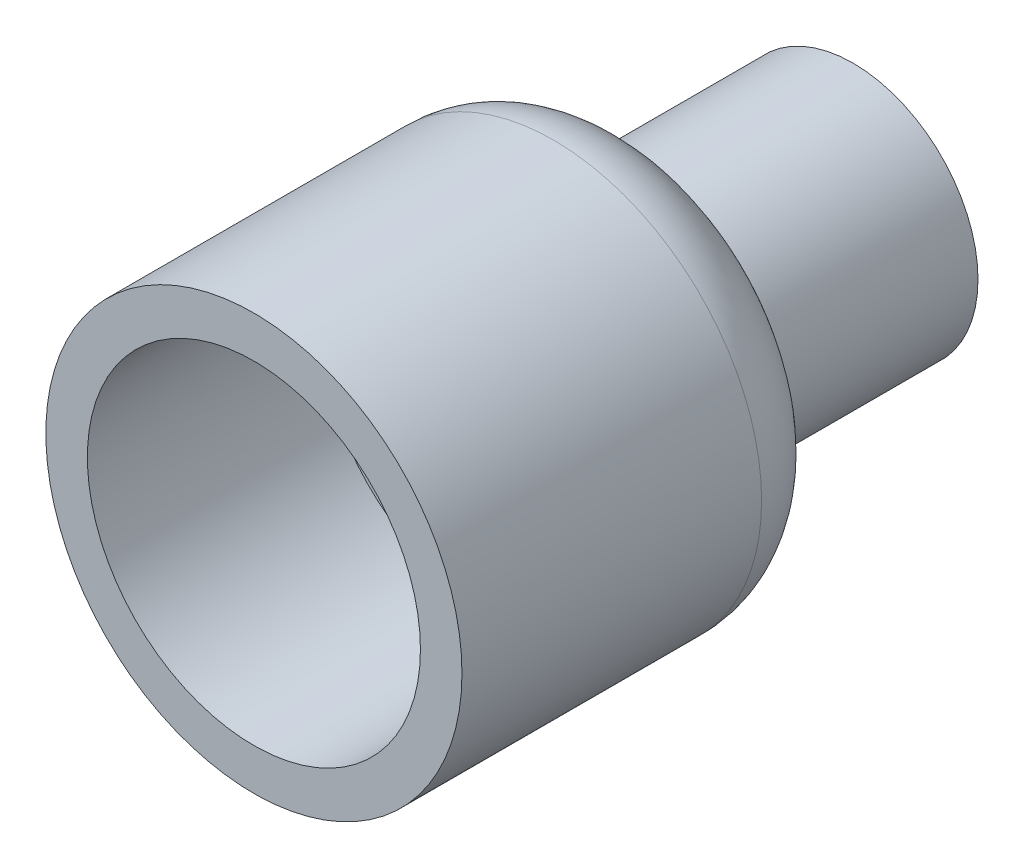
ISO-10303-21;
HEADER;
FILE_DESCRIPTION(('STEP AP214'),'2;1');
FILE_NAME('part.step','',(''),(''),'','','');
FILE_SCHEMA(('AUTOMOTIVE_DESIGN { 1 0 10303 214 1 1 1 1 }'));
ENDSEC;
DATA;
#1=APPLICATION_CONTEXT('core data for automotive mechanical design processes');
#2=APPLICATION_PROTOCOL_DEFINITION('international standard','automotive_design',2000,#1);
#3=PRODUCT_CONTEXT('',#1,'mechanical');
#4=PRODUCT('Part','Part','',(#3));
#5=PRODUCT_RELATED_PRODUCT_CATEGORY('part','',(#4));
#6=PRODUCT_DEFINITION_FORMATION('','',#4);
#7=PRODUCT_DEFINITION_CONTEXT('part definition',#1,'design');
#8=PRODUCT_DEFINITION('design','',#6,#7);
#9=PRODUCT_DEFINITION_SHAPE('','',#8);
#10=(LENGTH_UNIT() NAMED_UNIT(*) SI_UNIT(.MILLI.,.METRE.));
#11=(NAMED_UNIT(*) PLANE_ANGLE_UNIT() SI_UNIT($,.RADIAN.));
#12=(NAMED_UNIT(*) SI_UNIT($,.STERADIAN.) SOLID_ANGLE_UNIT());
#13=UNCERTAINTY_MEASURE_WITH_UNIT(LENGTH_MEASURE(1.E-05),#10,'distance_accuracy_value','');
#14=(GEOMETRIC_REPRESENTATION_CONTEXT(3) GLOBAL_UNCERTAINTY_ASSIGNED_CONTEXT((#13)) GLOBAL_UNIT_ASSIGNED_CONTEXT((#10,
#11,#12)) REPRESENTATION_CONTEXT('',''));
#15=CARTESIAN_POINT('',(0.,0.,0.));
#16=DIRECTION('',(0.,0.,1.));
#17=DIRECTION('',(1.,0.,0.));
#18=AXIS2_PLACEMENT_3D('',#15,#16,#17);
#19=CARTESIAN_POINT('',(0.,0.,16.));
#20=DIRECTION('',(0.,0.,-1.));
#21=DIRECTION('',(-1.,0.,0.));
#22=AXIS2_PLACEMENT_3D('',#19,#20,#21);
#23=CYLINDRICAL_SURFACE('',#22,7.5);
#24=CARTESIAN_POINT('',(0.,0.,0.));
#25=DIRECTION('',(0.,0.,1.));
#26=DIRECTION('',(1.,0.,0.));
#27=AXIS2_PLACEMENT_3D('',#24,#25,#26);
#28=CIRCLE('',#27,7.5);
#29=CARTESIAN_POINT('',(7.5,0.,0.));
#30=VERTEX_POINT('',#29);
#31=EDGE_CURVE('E42',#30,#30,#28,.T.);
#32=ORIENTED_EDGE('',*,*,#31,.T.);
#33=EDGE_LOOP('',(#32));
#34=FACE_BOUND('',#33,.T.);
#35=CARTESIAN_POINT('',(0.,0.,13.));
#36=DIRECTION('',(0.,0.,1.));
#37=DIRECTION('',(1.,0.,0.));
#38=AXIS2_PLACEMENT_3D('',#35,#36,#37);
#39=CIRCLE('',#38,7.5);
#40=CARTESIAN_POINT('',(7.5,0.,13.));
#41=VERTEX_POINT('',#40);
#42=EDGE_CURVE('E38',#41,#41,#39,.T.);
#43=ORIENTED_EDGE('',*,*,#42,.F.);
#44=EDGE_LOOP('',(#43));
#45=FACE_BOUND('',#44,.T.);
#46=ADVANCED_FACE('F31',(#34,#45),#23,.T.);
#47=CARTESIAN_POINT('',(0.,0.,0.));
#48=DIRECTION('',(0.,0.,1.));
#49=DIRECTION('',(1.,0.,0.));
#50=AXIS2_PLACEMENT_3D('',#47,#48,#49);
#51=PLANE('',#50);
#52=CARTESIAN_POINT('',(0.,0.,0.));
#53=DIRECTION('',(0.,0.,-1.));
#54=DIRECTION('',(-1.,0.,0.));
#55=AXIS2_PLACEMENT_3D('',#52,#53,#54);
#56=CIRCLE('',#55,5.005);
#57=CARTESIAN_POINT('',(-5.005,0.,0.));
#58=VERTEX_POINT('',#57);
#59=EDGE_CURVE('E58',#58,#58,#56,.T.);
#60=ORIENTED_EDGE('',*,*,#59,.F.);
#61=EDGE_LOOP('',(#60));
#62=FACE_BOUND('',#61,.T.);
#63=ORIENTED_EDGE('',*,*,#31,.F.);
#64=EDGE_LOOP('',(#63));
#65=FACE_BOUND('',#64,.T.);
#66=ADVANCED_FACE('F73',(#62,#65),#51,.F.);
#67=CARTESIAN_POINT('',(0.,0.,13.));
#68=DIRECTION('',(0.,0.,1.));
#69=DIRECTION('',(1.,0.,0.));
#70=AXIS2_PLACEMENT_3D('',#67,#68,#69);
#71=CYLINDRICAL_SURFACE('',#70,12.5);
#72=CARTESIAN_POINT('',(0.,0.,18.));
#73=DIRECTION('',(0.,0.,1.));
#74=DIRECTION('',(1.,0.,0.));
#75=AXIS2_PLACEMENT_3D('',#72,#73,#74);
#76=CIRCLE('',#75,12.5);
#77=CARTESIAN_POINT('',(12.5,0.,18.));
#78=VERTEX_POINT('',#77);
#79=EDGE_CURVE('E10',#78,#78,#76,.T.);
#80=CARTESIAN_POINT('',(0.,0.,36.));
#81=DIRECTION('',(0.,0.,1.));
#82=DIRECTION('',(1.,0.,0.));
#83=AXIS2_PLACEMENT_3D('',#80,#81,#82);
#84=CIRCLE('',#83,12.5);
#85=CARTESIAN_POINT('',(12.5,0.,36.));
#86=VERTEX_POINT('',#85);
#87=EDGE_CURVE('E46',#86,#86,#84,.T.);
#88=CARTESIAN_POINT('',(12.5,0.,18.));
#89=CARTESIAN_POINT('',(12.5,0.,18.1875));
#90=CARTESIAN_POINT('',(12.5,0.,18.375));
#91=CARTESIAN_POINT('',(12.5,0.,18.75));
#92=CARTESIAN_POINT('',(12.5,0.,18.9375));
#93=CARTESIAN_POINT('',(12.5,0.,19.3125));
#94=CARTESIAN_POINT('',(12.5,0.,19.5));
#95=CARTESIAN_POINT('',(12.5,0.,19.875));
#96=CARTESIAN_POINT('',(12.5,0.,20.0625));
#97=CARTESIAN_POINT('',(12.5,0.,20.4375));
#98=CARTESIAN_POINT('',(12.5,0.,20.625));
#99=CARTESIAN_POINT('',(12.5,0.,21.));
#100=CARTESIAN_POINT('',(12.5,0.,21.1875));
#101=CARTESIAN_POINT('',(12.5,0.,21.5625));
#102=CARTESIAN_POINT('',(12.5,0.,21.75));
#103=CARTESIAN_POINT('',(12.5,0.,22.125));
#104=CARTESIAN_POINT('',(12.5,0.,22.3125));
#105=CARTESIAN_POINT('',(12.5,0.,22.6875));
#106=CARTESIAN_POINT('',(12.5,0.,22.875));
#107=CARTESIAN_POINT('',(12.5,0.,23.25));
#108=CARTESIAN_POINT('',(12.5,0.,23.4375));
#109=CARTESIAN_POINT('',(12.5,0.,23.8125));
#110=CARTESIAN_POINT('',(12.5,0.,24.));
#111=CARTESIAN_POINT('',(12.5,0.,24.375));
#112=CARTESIAN_POINT('',(12.5,0.,24.5625));
#113=CARTESIAN_POINT('',(12.5,0.,24.9375));
#114=CARTESIAN_POINT('',(12.5,0.,25.125));
#115=CARTESIAN_POINT('',(12.5,0.,25.5));
#116=CARTESIAN_POINT('',(12.5,0.,25.6875));
#117=CARTESIAN_POINT('',(12.5,0.,26.0625));
#118=CARTESIAN_POINT('',(12.5,0.,26.25));
#119=CARTESIAN_POINT('',(12.5,0.,26.625));
#120=CARTESIAN_POINT('',(12.5,0.,26.8125));
#121=CARTESIAN_POINT('',(12.5,0.,27.1875));
#122=CARTESIAN_POINT('',(12.5,0.,27.375));
#123=CARTESIAN_POINT('',(12.5,0.,27.75));
#124=CARTESIAN_POINT('',(12.5,0.,27.9375));
#125=CARTESIAN_POINT('',(12.5,0.,28.3125));
#126=CARTESIAN_POINT('',(12.5,0.,28.5));
#127=CARTESIAN_POINT('',(12.5,0.,28.875));
#128=CARTESIAN_POINT('',(12.5,0.,29.0625));
#129=CARTESIAN_POINT('',(12.5,0.,29.4375));
#130=CARTESIAN_POINT('',(12.5,0.,29.625));
#131=CARTESIAN_POINT('',(12.5,0.,30.));
#132=CARTESIAN_POINT('',(12.5,0.,30.1875));
#133=CARTESIAN_POINT('',(12.5,0.,30.5625));
#134=CARTESIAN_POINT('',(12.5,0.,30.75));
#135=CARTESIAN_POINT('',(12.5,0.,31.125));
#136=CARTESIAN_POINT('',(12.5,0.,31.3125));
#137=CARTESIAN_POINT('',(12.5,0.,31.6875));
#138=CARTESIAN_POINT('',(12.5,0.,31.875));
#139=CARTESIAN_POINT('',(12.5,0.,32.25));
#140=CARTESIAN_POINT('',(12.5,0.,32.4375));
#141=CARTESIAN_POINT('',(12.5,0.,32.8125));
#142=CARTESIAN_POINT('',(12.5,0.,33.));
#143=CARTESIAN_POINT('',(12.5,0.,33.375));
#144=CARTESIAN_POINT('',(12.5,0.,33.5625));
#145=CARTESIAN_POINT('',(12.5,0.,33.9375));
#146=CARTESIAN_POINT('',(12.5,0.,34.125));
#147=CARTESIAN_POINT('',(12.5,0.,34.5));
#148=CARTESIAN_POINT('',(12.5,0.,34.6875));
#149=CARTESIAN_POINT('',(12.5,0.,35.0625));
#150=CARTESIAN_POINT('',(12.5,0.,35.25));
#151=CARTESIAN_POINT('',(12.5,0.,35.625));
#152=CARTESIAN_POINT('',(12.5,0.,35.8125));
#153=CARTESIAN_POINT('',(12.5,0.,36.));
#154=B_SPLINE_CURVE_WITH_KNOTS('',3,(#88,#89,#90,#91,#92,#93,#94,#95,#96,#97,#98,#99,#100,#101,
#102,#103,#104,#105,#106,#107,#108,#109,#110,#111,#112,#113,#114,#115,#116,#117,#118,#119,#120,
#121,#122,#123,#124,#125,#126,#127,#128,#129,#130,#131,#132,#133,#134,#135,#136,#137,#138,#139,
#140,#141,#142,#143,#144,#145,#146,#147,#148,#149,#150,#151,#152,#153),.UNSPECIFIED.,.F.,.F.,(4,
2,2,2,2,2,2,2,2,2,2,2,2,2,2,2,2,2,2,2,2,2,2,2,2,2,2,2,2,2,2,2,4),(0.,0.5625,1.125,1.6875,2.25,
2.8125,3.375,3.9375,4.5,5.0625,5.625,6.1875,6.75,7.3125,7.875,8.4375,9.,9.5625,10.125,10.6875,
11.25,11.8125,12.375,12.9375,13.5,14.0625,14.625,15.1875,15.75,16.3125,16.875,17.4375,18.),.UNSPECIFIED.);
#155=EDGE_CURVE('BSEAM76',#78,#86,#154,.T.);
#156=ORIENTED_EDGE('',*,*,#79,.T.);
#157=ORIENTED_EDGE('',*,*,#87,.F.);
#158=ORIENTED_EDGE('',*,*,#155,.T.);
#159=ORIENTED_EDGE('',*,*,#155,.F.);
#160=EDGE_LOOP('',(#156,#158,#157,#159));
#161=FACE_BOUND('',#160,.T.);
#162=ADVANCED_FACE('F76',(#161),#71,.T.);
#163=CARTESIAN_POINT('',(0.,0.,36.));
#164=DIRECTION('',(0.,0.,1.));
#165=DIRECTION('',(1.,0.,0.));
#166=AXIS2_PLACEMENT_3D('',#163,#164,#165);
#167=PLANE('',#166);
#168=CARTESIAN_POINT('',(0.,0.,36.));
#169=DIRECTION('',(0.,0.,1.));
#170=DIRECTION('',(1.,0.,0.));
#171=AXIS2_PLACEMENT_3D('',#168,#169,#170);
#172=CIRCLE('',#171,10.005);
#173=CARTESIAN_POINT('',(10.005,0.,36.));
#174=VERTEX_POINT('',#173);
#175=EDGE_CURVE('E52',#174,#174,#172,.T.);
#176=ORIENTED_EDGE('',*,*,#175,.F.);
#177=EDGE_LOOP('',(#176));
#178=FACE_BOUND('',#177,.T.);
#179=ORIENTED_EDGE('',*,*,#87,.T.);
#180=EDGE_LOOP('',(#179));
#181=FACE_BOUND('',#180,.T.);
#182=ADVANCED_FACE('F88',(#178,#181),#167,.T.);
#183=CARTESIAN_POINT('',(0.,0.,18.));
#184=DIRECTION('',(0.,0.,1.));
#185=DIRECTION('',(1.,0.,0.));
#186=AXIS2_PLACEMENT_3D('',#183,#184,#185);
#187=TOROIDAL_SURFACE('',#186,7.5,5.);
#188=ORIENTED_EDGE('',*,*,#42,.T.);
#189=EDGE_LOOP('',(#188));
#190=FACE_BOUND('',#189,.T.);
#191=ORIENTED_EDGE('',*,*,#79,.F.);
#192=EDGE_LOOP('',(#191));
#193=FACE_BOUND('',#192,.T.);
#194=ADVANCED_FACE('F33',(#190,#193),#187,.T.);
#195=CARTESIAN_POINT('',(0.,0.,22.));
#196=DIRECTION('',(0.,0.,1.));
#197=DIRECTION('',(1.,0.,0.));
#198=AXIS2_PLACEMENT_3D('',#195,#196,#197);
#199=CYLINDRICAL_SURFACE('',#198,10.005);
#200=CARTESIAN_POINT('',(0.,0.,22.));
#201=DIRECTION('',(0.,0.,1.));
#202=DIRECTION('',(1.,0.,0.));
#203=AXIS2_PLACEMENT_3D('',#200,#201,#202);
#204=CIRCLE('',#203,10.005);
#205=CARTESIAN_POINT('',(10.005,0.,22.));
#206=VERTEX_POINT('',#205);
#207=EDGE_CURVE('E51',#206,#206,#204,.T.);
#208=ORIENTED_EDGE('',*,*,#207,.F.);
#209=EDGE_LOOP('',(#208));
#210=FACE_BOUND('',#209,.T.);
#211=ORIENTED_EDGE('',*,*,#175,.T.);
#212=EDGE_LOOP('',(#211));
#213=FACE_BOUND('',#212,.T.);
#214=ADVANCED_FACE('F92',(#210,#213),#199,.F.);
#215=CARTESIAN_POINT('',(0.,0.,22.));
#216=DIRECTION('',(0.,0.,1.));
#217=DIRECTION('',(1.,0.,0.));
#218=AXIS2_PLACEMENT_3D('',#215,#216,#217);
#219=PLANE('',#218);
#220=ORIENTED_EDGE('',*,*,#207,.T.);
#221=EDGE_LOOP('',(#220));
#222=FACE_BOUND('',#221,.T.);
#223=ADVANCED_FACE('F69',(#222),#219,.T.);
#224=CARTESIAN_POINT('',(0.,0.,10.));
#225=DIRECTION('',(0.,0.,-1.));
#226=DIRECTION('',(-1.,0.,0.));
#227=AXIS2_PLACEMENT_3D('',#224,#225,#226);
#228=CYLINDRICAL_SURFACE('',#227,5.005);
#229=CARTESIAN_POINT('',(0.,0.,10.));
#230=DIRECTION('',(0.,0.,-1.));
#231=DIRECTION('',(-1.,0.,0.));
#232=AXIS2_PLACEMENT_3D('',#229,#230,#231);
#233=CIRCLE('',#232,5.005);
#234=CARTESIAN_POINT('',(-5.005,0.,10.));
#235=VERTEX_POINT('',#234);
#236=EDGE_CURVE('E55',#235,#235,#233,.T.);
#237=ORIENTED_EDGE('',*,*,#236,.F.);
#238=EDGE_LOOP('',(#237));
#239=FACE_BOUND('',#238,.T.);
#240=ORIENTED_EDGE('',*,*,#59,.T.);
#241=EDGE_LOOP('',(#240));
#242=FACE_BOUND('',#241,.T.);
#243=ADVANCED_FACE('F66',(#239,#242),#228,.F.);
#244=CARTESIAN_POINT('',(0.,0.,10.));
#245=DIRECTION('',(0.,0.,-1.));
#246=DIRECTION('',(-1.,0.,0.));
#247=AXIS2_PLACEMENT_3D('',#244,#245,#246);
#248=PLANE('',#247);
#249=ORIENTED_EDGE('',*,*,#236,.T.);
#250=EDGE_LOOP('',(#249));
#251=FACE_BOUND('',#250,.T.);
#252=ADVANCED_FACE('F64',(#251),#248,.T.);
#253=CLOSED_SHELL('',(#46,#66,#162,#182,#194,#214,#223,#243,#252));
#254=MANIFOLD_SOLID_BREP('B2',#253);
#255=ADVANCED_BREP_SHAPE_REPRESENTATION('',(#18,#254),#14);
#256=SHAPE_DEFINITION_REPRESENTATION(#9,#255);
ENDSEC;
END-ISO-10303-21;
